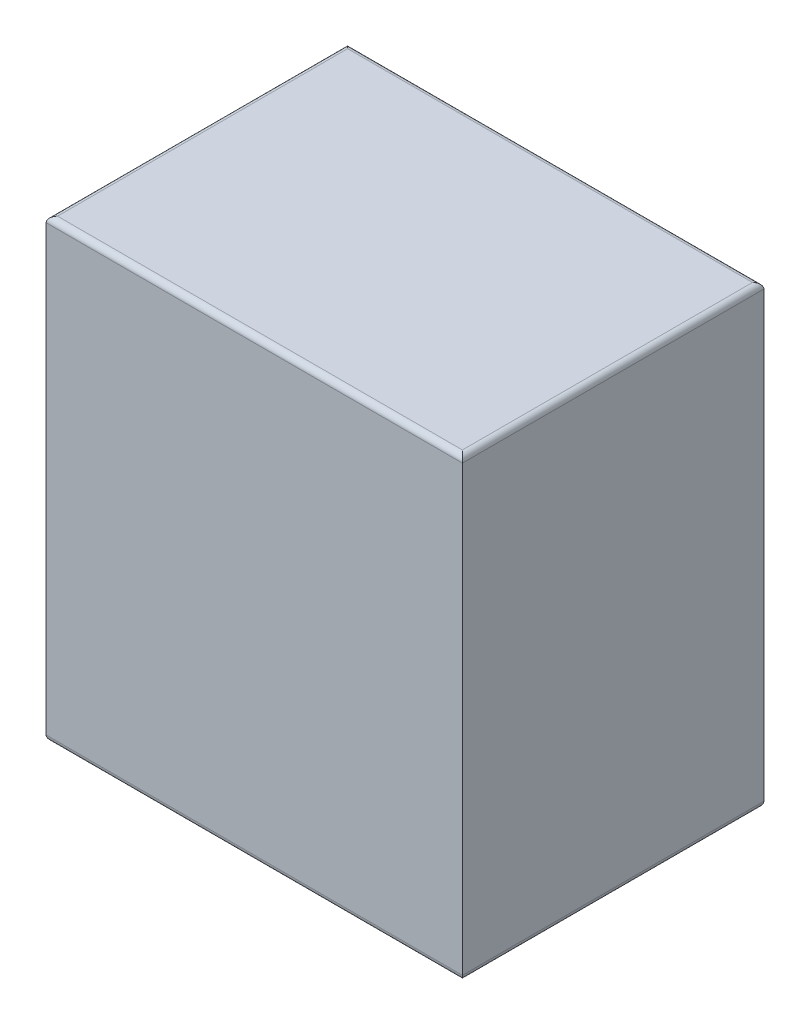
ISO-10303-21;
HEADER;
FILE_DESCRIPTION(('STEP AP214'),'2;1');
FILE_NAME('part.step','',(''),(''),'','','');
FILE_SCHEMA(('AUTOMOTIVE_DESIGN { 1 0 10303 214 1 1 1 1 }'));
ENDSEC;
DATA;
#1=APPLICATION_CONTEXT('core data for automotive mechanical design processes');
#2=APPLICATION_PROTOCOL_DEFINITION('international standard','automotive_design',2000,#1);
#3=PRODUCT_CONTEXT('',#1,'mechanical');
#4=PRODUCT('Part','Part','',(#3));
#5=PRODUCT_RELATED_PRODUCT_CATEGORY('part','',(#4));
#6=PRODUCT_DEFINITION_FORMATION('','',#4);
#7=PRODUCT_DEFINITION_CONTEXT('part definition',#1,'design');
#8=PRODUCT_DEFINITION('design','',#6,#7);
#9=PRODUCT_DEFINITION_SHAPE('','',#8);
#10=(LENGTH_UNIT() NAMED_UNIT(*) SI_UNIT(.MILLI.,.METRE.));
#11=(NAMED_UNIT(*) PLANE_ANGLE_UNIT() SI_UNIT($,.RADIAN.));
#12=(NAMED_UNIT(*) SI_UNIT($,.STERADIAN.) SOLID_ANGLE_UNIT());
#13=UNCERTAINTY_MEASURE_WITH_UNIT(LENGTH_MEASURE(1.E-05),#10,'distance_accuracy_value','');
#14=(GEOMETRIC_REPRESENTATION_CONTEXT(3) GLOBAL_UNCERTAINTY_ASSIGNED_CONTEXT((#13)) GLOBAL_UNIT_ASSIGNED_CONTEXT((#10,
#11,#12)) REPRESENTATION_CONTEXT('',''));
#15=CARTESIAN_POINT('',(0.,0.,0.));
#16=DIRECTION('',(0.,0.,1.));
#17=DIRECTION('',(1.,0.,0.));
#18=AXIS2_PLACEMENT_3D('',#15,#16,#17);
#19=CARTESIAN_POINT('',(37.0000003802642,40.,-0.430000271371788));
#20=DIRECTION('',(0.,0.,-1.));
#21=DIRECTION('',(-1.,0.,0.));
#22=AXIS2_PLACEMENT_3D('',#19,#20,#21);
#23=PLANE('',#22);
#24=DIRECTION('',(0.,-1.,0.));
#25=VECTOR('',#24,1.);
#26=CARTESIAN_POINT('',(0.400000380264234,40.,-0.430000271371784));
#27=LINE('',#26,#25);
#28=CARTESIAN_POINT('',(0.400000380264234,39.5,-0.430000271371784));
#29=VERTEX_POINT('',#28);
#30=CARTESIAN_POINT('',(0.400000380264234,0.5,-0.430000271371784));
#31=VERTEX_POINT('',#30);
#32=EDGE_CURVE('E163',#29,#31,#27,.T.);
#33=ORIENTED_EDGE('',*,*,#32,.T.);
#34=DIRECTION('',(1.,0.,0.));
#35=VECTOR('',#34,1.);
#36=CARTESIAN_POINT('',(37.0000003802642,0.5,-0.430000271371788));
#37=LINE('',#36,#35);
#38=CARTESIAN_POINT('',(37.0000003802642,0.5,-0.430000271371788));
#39=VERTEX_POINT('',#38);
#40=EDGE_CURVE('E130',#31,#39,#37,.T.);
#41=ORIENTED_EDGE('',*,*,#40,.T.);
#42=DIRECTION('',(0.,-1.,0.));
#43=VECTOR('',#42,1.);
#44=CARTESIAN_POINT('',(37.0000003802642,40.,-0.430000271371788));
#45=LINE('',#44,#43);
#46=CARTESIAN_POINT('',(37.0000003802642,39.5,-0.430000271371788));
#47=VERTEX_POINT('',#46);
#48=EDGE_CURVE('E114',#47,#39,#45,.T.);
#49=ORIENTED_EDGE('',*,*,#48,.F.);
#50=DIRECTION('',(1.,0.,0.));
#51=VECTOR('',#50,1.);
#52=CARTESIAN_POINT('',(37.0000003802642,39.5,-0.430000271371788));
#53=LINE('',#52,#51);
#54=EDGE_CURVE('E127',#47,#29,#53,.F.);
#55=ORIENTED_EDGE('',*,*,#54,.T.);
#56=EDGE_LOOP('',(#33,#41,#49,#55));
#57=FACE_BOUND('',#56,.T.);
#58=ADVANCED_FACE('F43',(#57),#23,.F.);
#59=CARTESIAN_POINT('',(37.0000003802642,40.,-26.9300002713718));
#60=DIRECTION('',(-1.,0.,0.));
#61=DIRECTION('',(0.,0.,1.));
#62=AXIS2_PLACEMENT_3D('',#59,#60,#61);
#63=PLANE('',#62);
#64=ORIENTED_EDGE('',*,*,#48,.T.);
#65=DIRECTION('',(0.,0.,-1.));
#66=VECTOR('',#65,1.);
#67=CARTESIAN_POINT('',(37.0000003802642,0.5,-26.9300002713718));
#68=LINE('',#67,#66);
#69=CARTESIAN_POINT('',(37.0000003802642,0.5,-26.9300002713718));
#70=VERTEX_POINT('',#69);
#71=EDGE_CURVE('E120',#39,#70,#68,.T.);
#72=ORIENTED_EDGE('',*,*,#71,.T.);
#73=DIRECTION('',(0.,-1.,0.));
#74=VECTOR('',#73,1.);
#75=CARTESIAN_POINT('',(37.0000003802642,40.,-26.9300002713718));
#76=LINE('',#75,#74);
#77=CARTESIAN_POINT('',(37.0000003802642,39.5,-26.9300002713718));
#78=VERTEX_POINT('',#77);
#79=EDGE_CURVE('E116',#78,#70,#76,.T.);
#80=ORIENTED_EDGE('',*,*,#79,.F.);
#81=DIRECTION('',(0.,0.,-1.));
#82=VECTOR('',#81,1.);
#83=CARTESIAN_POINT('',(37.0000003802642,39.5,-26.9300002713718));
#84=LINE('',#83,#82);
#85=EDGE_CURVE('E111',#78,#47,#84,.F.);
#86=ORIENTED_EDGE('',*,*,#85,.T.);
#87=EDGE_LOOP('',(#64,#72,#80,#86));
#88=FACE_BOUND('',#87,.T.);
#89=ADVANCED_FACE('F113',(#88),#63,.F.);
#90=CARTESIAN_POINT('',(0.400000380264241,40.,-26.9300002713718));
#91=DIRECTION('',(0.,0.,1.));
#92=DIRECTION('',(1.,0.,0.));
#93=AXIS2_PLACEMENT_3D('',#90,#91,#92);
#94=PLANE('',#93);
#95=ORIENTED_EDGE('',*,*,#79,.T.);
#96=DIRECTION('',(-1.,0.,0.));
#97=VECTOR('',#96,1.);
#98=CARTESIAN_POINT('',(0.400000380264241,0.5,-26.9300002713718));
#99=LINE('',#98,#97);
#100=CARTESIAN_POINT('',(0.400000380264241,0.5,-26.9300002713718));
#101=VERTEX_POINT('',#100);
#102=EDGE_CURVE('E187',#70,#101,#99,.T.);
#103=ORIENTED_EDGE('',*,*,#102,.T.);
#104=DIRECTION('',(0.,-1.,0.));
#105=VECTOR('',#104,1.);
#106=CARTESIAN_POINT('',(0.400000380264241,40.,-26.9300002713718));
#107=LINE('',#106,#105);
#108=CARTESIAN_POINT('',(0.400000380264241,39.5,-26.9300002713718));
#109=VERTEX_POINT('',#108);
#110=EDGE_CURVE('E168',#109,#101,#107,.T.);
#111=ORIENTED_EDGE('',*,*,#110,.F.);
#112=DIRECTION('',(-1.,0.,0.));
#113=VECTOR('',#112,1.);
#114=CARTESIAN_POINT('',(0.400000380264241,39.5,-26.9300002713718));
#115=LINE('',#114,#113);
#116=EDGE_CURVE('E185',#109,#78,#115,.F.);
#117=ORIENTED_EDGE('',*,*,#116,.T.);
#118=EDGE_LOOP('',(#95,#103,#111,#117));
#119=FACE_BOUND('',#118,.T.);
#120=ADVANCED_FACE('F204',(#119),#94,.F.);
#121=CARTESIAN_POINT('',(0.400000380264234,40.,-0.430000271371784));
#122=DIRECTION('',(1.,0.,0.));
#123=DIRECTION('',(0.,0.,-1.));
#124=AXIS2_PLACEMENT_3D('',#121,#122,#123);
#125=PLANE('',#124);
#126=ORIENTED_EDGE('',*,*,#110,.T.);
#127=DIRECTION('',(0.,0.,1.));
#128=VECTOR('',#127,1.);
#129=CARTESIAN_POINT('',(0.400000380264234,0.5,-0.430000271371784));
#130=LINE('',#129,#128);
#131=EDGE_CURVE('E191',#101,#31,#130,.T.);
#132=ORIENTED_EDGE('',*,*,#131,.T.);
#133=ORIENTED_EDGE('',*,*,#32,.F.);
#134=DIRECTION('',(0.,0.,1.));
#135=VECTOR('',#134,1.);
#136=CARTESIAN_POINT('',(0.400000380264234,39.5,-0.430000271371784));
#137=LINE('',#136,#135);
#138=EDGE_CURVE('E189',#29,#109,#137,.F.);
#139=ORIENTED_EDGE('',*,*,#138,.T.);
#140=EDGE_LOOP('',(#126,#132,#133,#139));
#141=FACE_BOUND('',#140,.T.);
#142=ADVANCED_FACE('F202',(#141),#125,.F.);
#143=CARTESIAN_POINT('',(0.,40.,0.));
#144=DIRECTION('',(0.,-1.,0.));
#145=DIRECTION('',(0.,0.,-1.));
#146=AXIS2_PLACEMENT_3D('',#143,#144,#145);
#147=PLANE('',#146);
#148=DIRECTION('',(0.,0.,1.));
#149=VECTOR('',#148,1.);
#150=CARTESIAN_POINT('',(0.900000380264234,40.,0.));
#151=LINE('',#150,#149);
#152=CARTESIAN_POINT('',(0.900000380264241,40.,-26.4300002713718));
#153=VERTEX_POINT('',#152);
#154=CARTESIAN_POINT('',(0.900000380264234,40.,-0.930000271371784));
#155=VERTEX_POINT('',#154);
#156=EDGE_CURVE('E193',#153,#155,#151,.T.);
#157=ORIENTED_EDGE('',*,*,#156,.T.);
#158=DIRECTION('',(1.,0.,0.));
#159=VECTOR('',#158,1.);
#160=CARTESIAN_POINT('',(0.,40.,-0.930000271371784));
#161=LINE('',#160,#159);
#162=CARTESIAN_POINT('',(36.5000003802642,40.,-0.930000271371788));
#163=VERTEX_POINT('',#162);
#164=EDGE_CURVE('E11',#155,#163,#161,.T.);
#165=ORIENTED_EDGE('',*,*,#164,.T.);
#166=DIRECTION('',(0.,0.,-1.));
#167=VECTOR('',#166,1.);
#168=CARTESIAN_POINT('',(36.5000003802642,40.,0.));
#169=LINE('',#168,#167);
#170=CARTESIAN_POINT('',(36.5000003802642,40.,-26.4300002713718));
#171=VERTEX_POINT('',#170);
#172=EDGE_CURVE('E52',#163,#171,#169,.T.);
#173=ORIENTED_EDGE('',*,*,#172,.T.);
#174=DIRECTION('',(-1.,0.,0.));
#175=VECTOR('',#174,1.);
#176=CARTESIAN_POINT('',(0.,40.,-26.4300002713718));
#177=LINE('',#176,#175);
#178=EDGE_CURVE('E195',#171,#153,#177,.T.);
#179=ORIENTED_EDGE('',*,*,#178,.T.);
#180=EDGE_LOOP('',(#157,#165,#173,#179));
#181=FACE_BOUND('',#180,.T.);
#182=ADVANCED_FACE('F196',(#181),#147,.F.);
#183=CARTESIAN_POINT('',(0.,0.,0.));
#184=DIRECTION('',(0.,-1.,0.));
#185=DIRECTION('',(0.,0.,-1.));
#186=AXIS2_PLACEMENT_3D('',#183,#184,#185);
#187=PLANE('',#186);
#188=DIRECTION('',(0.,0.,-1.));
#189=VECTOR('',#188,1.);
#190=CARTESIAN_POINT('',(36.5000003802642,0.,-0.430000271371786));
#191=LINE('',#190,#189);
#192=CARTESIAN_POINT('',(36.5000003802642,0.,-26.4300002713718));
#193=VERTEX_POINT('',#192);
#194=CARTESIAN_POINT('',(36.5000003802642,0.,-0.930000271371787));
#195=VERTEX_POINT('',#194);
#196=EDGE_CURVE('E180',#193,#195,#191,.F.);
#197=ORIENTED_EDGE('',*,*,#196,.T.);
#198=DIRECTION('',(1.,0.,0.));
#199=VECTOR('',#198,1.);
#200=CARTESIAN_POINT('',(0.400000380264234,0.,-0.930000271371784));
#201=LINE('',#200,#199);
#202=CARTESIAN_POINT('',(0.900000380264234,0.,-0.930000271371784));
#203=VERTEX_POINT('',#202);
#204=EDGE_CURVE('E121',#195,#203,#201,.F.);
#205=ORIENTED_EDGE('',*,*,#204,.T.);
#206=DIRECTION('',(0.,0.,1.));
#207=VECTOR('',#206,1.);
#208=CARTESIAN_POINT('',(0.900000380264241,0.,-26.9300002713718));
#209=LINE('',#208,#207);
#210=CARTESIAN_POINT('',(0.900000380264241,0.,-26.4300002713718));
#211=VERTEX_POINT('',#210);
#212=EDGE_CURVE('E176',#203,#211,#209,.F.);
#213=ORIENTED_EDGE('',*,*,#212,.T.);
#214=DIRECTION('',(-1.,0.,0.));
#215=VECTOR('',#214,1.);
#216=CARTESIAN_POINT('',(37.0000003802642,0.,-26.4300002713718));
#217=LINE('',#216,#215);
#218=EDGE_CURVE('E178',#211,#193,#217,.F.);
#219=ORIENTED_EDGE('',*,*,#218,.T.);
#220=EDGE_LOOP('',(#197,#205,#213,#219));
#221=FACE_BOUND('',#220,.T.);
#222=ADVANCED_FACE('F230',(#221),#187,.T.);
#223=CARTESIAN_POINT('',(0.400000380264241,0.5,-26.4300002713718));
#224=DIRECTION('',(1.,0.,0.));
#225=DIRECTION('',(0.,0.,-1.));
#226=AXIS2_PLACEMENT_3D('',#223,#224,#225);
#227=CYLINDRICAL_SURFACE('',#226,0.5);
#228=CARTESIAN_POINT('',(36.5000003802642,0.5,-26.4300002713718));
#229=DIRECTION('',(0.707106781186547,0.,0.707106781186548));
#230=DIRECTION('',(0.707106781186548,0.,-0.707106781186547));
#231=AXIS2_PLACEMENT_3D('',#228,#229,#230);
#232=ELLIPSE('',#231,0.707106781186548,0.5);
#233=EDGE_CURVE('E155',#193,#70,#232,.T.);
#234=ORIENTED_EDGE('',*,*,#233,.F.);
#235=ORIENTED_EDGE('',*,*,#218,.F.);
#236=CARTESIAN_POINT('',(0.900000380264241,0.5,-26.4300002713718));
#237=DIRECTION('',(0.707106781186548,0.,-0.707106781186547));
#238=DIRECTION('',(-0.707106781186547,0.,-0.707106781186548));
#239=AXIS2_PLACEMENT_3D('',#236,#237,#238);
#240=ELLIPSE('',#239,0.707106781186547,0.5);
#241=EDGE_CURVE('E142',#101,#211,#240,.F.);
#242=ORIENTED_EDGE('',*,*,#241,.F.);
#243=ORIENTED_EDGE('',*,*,#102,.F.);
#244=EDGE_LOOP('',(#234,#235,#242,#243));
#245=FACE_BOUND('',#244,.T.);
#246=ADVANCED_FACE('F207',(#245),#227,.T.);
#247=CARTESIAN_POINT('',(0.900000380264234,0.5,-0.430000271371784));
#248=DIRECTION('',(0.,0.,-1.));
#249=DIRECTION('',(-1.,0.,0.));
#250=AXIS2_PLACEMENT_3D('',#247,#248,#249);
#251=CYLINDRICAL_SURFACE('',#250,0.5);
#252=ORIENTED_EDGE('',*,*,#241,.T.);
#253=ORIENTED_EDGE('',*,*,#212,.F.);
#254=CARTESIAN_POINT('',(0.900000380264234,0.5,-0.930000271371784));
#255=DIRECTION('',(-0.707106781186547,0.,-0.707106781186547));
#256=DIRECTION('',(0.707106781186548,0.,-0.707106781186547));
#257=AXIS2_PLACEMENT_3D('',#254,#255,#256);
#258=ELLIPSE('',#257,0.707106781186548,0.5);
#259=EDGE_CURVE('E149',#31,#203,#258,.F.);
#260=ORIENTED_EDGE('',*,*,#259,.F.);
#261=ORIENTED_EDGE('',*,*,#131,.F.);
#262=EDGE_LOOP('',(#252,#253,#260,#261));
#263=FACE_BOUND('',#262,.T.);
#264=ADVANCED_FACE('F209',(#263),#251,.T.);
#265=CARTESIAN_POINT('',(36.5000003802642,0.5,-26.9300002713718));
#266=DIRECTION('',(0.,0.,1.));
#267=DIRECTION('',(1.,0.,0.));
#268=AXIS2_PLACEMENT_3D('',#265,#266,#267);
#269=CYLINDRICAL_SURFACE('',#268,0.5);
#270=ORIENTED_EDGE('',*,*,#233,.T.);
#271=ORIENTED_EDGE('',*,*,#71,.F.);
#272=CARTESIAN_POINT('',(36.5000003802642,0.5,-0.930000271371787));
#273=DIRECTION('',(-0.707106781186548,0.,0.707106781186547));
#274=DIRECTION('',(0.707106781186547,0.,0.707106781186547));
#275=AXIS2_PLACEMENT_3D('',#272,#273,#274);
#276=ELLIPSE('',#275,0.707106781186547,0.5);
#277=EDGE_CURVE('E145',#195,#39,#276,.T.);
#278=ORIENTED_EDGE('',*,*,#277,.F.);
#279=ORIENTED_EDGE('',*,*,#196,.F.);
#280=EDGE_LOOP('',(#270,#271,#278,#279));
#281=FACE_BOUND('',#280,.T.);
#282=ADVANCED_FACE('F212',(#281),#269,.T.);
#283=CARTESIAN_POINT('',(37.0000003802642,0.5,-0.930000271371788));
#284=DIRECTION('',(-1.,0.,0.));
#285=DIRECTION('',(0.,0.,1.));
#286=AXIS2_PLACEMENT_3D('',#283,#284,#285);
#287=CYLINDRICAL_SURFACE('',#286,0.5);
#288=ORIENTED_EDGE('',*,*,#259,.T.);
#289=ORIENTED_EDGE('',*,*,#204,.F.);
#290=ORIENTED_EDGE('',*,*,#277,.T.);
#291=ORIENTED_EDGE('',*,*,#40,.F.);
#292=EDGE_LOOP('',(#288,#289,#290,#291));
#293=FACE_BOUND('',#292,.T.);
#294=ADVANCED_FACE('F210',(#293),#287,.T.);
#295=CARTESIAN_POINT('',(0.,39.5,-26.4300002713718));
#296=DIRECTION('',(-1.,0.,0.));
#297=DIRECTION('',(0.,0.,1.));
#298=AXIS2_PLACEMENT_3D('',#295,#296,#297);
#299=CYLINDRICAL_SURFACE('',#298,0.5);
#300=CARTESIAN_POINT('',(36.5000003802642,39.5,-26.4300002713718));
#301=DIRECTION('',(-0.707106781186547,0.,-0.707106781186548));
#302=DIRECTION('',(-0.707106781186548,0.,0.707106781186547));
#303=AXIS2_PLACEMENT_3D('',#300,#301,#302);
#304=ELLIPSE('',#303,0.707106781186548,0.5);
#305=EDGE_CURVE('E139',#78,#171,#304,.F.);
#306=ORIENTED_EDGE('',*,*,#305,.F.);
#307=ORIENTED_EDGE('',*,*,#116,.F.);
#308=CARTESIAN_POINT('',(0.900000380264241,39.5,-26.4300002713718));
#309=DIRECTION('',(-0.707106781186548,0.,0.707106781186547));
#310=DIRECTION('',(0.707106781186547,0.,0.707106781186548));
#311=AXIS2_PLACEMENT_3D('',#308,#309,#310);
#312=ELLIPSE('',#311,0.707106781186547,0.5);
#313=EDGE_CURVE('E47',#153,#109,#312,.T.);
#314=ORIENTED_EDGE('',*,*,#313,.F.);
#315=ORIENTED_EDGE('',*,*,#178,.F.);
#316=EDGE_LOOP('',(#306,#307,#314,#315));
#317=FACE_BOUND('',#316,.T.);
#318=ADVANCED_FACE('F45',(#317),#299,.T.);
#319=CARTESIAN_POINT('',(0.900000380264234,39.5,0.));
#320=DIRECTION('',(0.,0.,1.));
#321=DIRECTION('',(1.,0.,0.));
#322=AXIS2_PLACEMENT_3D('',#319,#320,#321);
#323=CYLINDRICAL_SURFACE('',#322,0.5);
#324=ORIENTED_EDGE('',*,*,#313,.T.);
#325=ORIENTED_EDGE('',*,*,#138,.F.);
#326=CARTESIAN_POINT('',(0.900000380264234,39.5,-0.930000271371784));
#327=DIRECTION('',(0.707106781186547,0.,0.707106781186547));
#328=DIRECTION('',(-0.707106781186548,0.,0.707106781186547));
#329=AXIS2_PLACEMENT_3D('',#326,#327,#328);
#330=ELLIPSE('',#329,0.707106781186548,0.5);
#331=EDGE_CURVE('E134',#155,#29,#330,.T.);
#332=ORIENTED_EDGE('',*,*,#331,.F.);
#333=ORIENTED_EDGE('',*,*,#156,.F.);
#334=EDGE_LOOP('',(#324,#325,#332,#333));
#335=FACE_BOUND('',#334,.T.);
#336=ADVANCED_FACE('F199',(#335),#323,.T.);
#337=CARTESIAN_POINT('',(36.5000003802642,39.5,0.));
#338=DIRECTION('',(0.,0.,-1.));
#339=DIRECTION('',(-1.,0.,0.));
#340=AXIS2_PLACEMENT_3D('',#337,#338,#339);
#341=CYLINDRICAL_SURFACE('',#340,0.5);
#342=ORIENTED_EDGE('',*,*,#305,.T.);
#343=ORIENTED_EDGE('',*,*,#172,.F.);
#344=CARTESIAN_POINT('',(36.5000003802642,39.5,-0.930000271371788));
#345=DIRECTION('',(0.707106781186548,0.,-0.707106781186547));
#346=DIRECTION('',(-0.707106781186547,0.,-0.707106781186547));
#347=AXIS2_PLACEMENT_3D('',#344,#345,#346);
#348=ELLIPSE('',#347,0.707106781186547,0.5);
#349=EDGE_CURVE('E60',#47,#163,#348,.F.);
#350=ORIENTED_EDGE('',*,*,#349,.F.);
#351=ORIENTED_EDGE('',*,*,#85,.F.);
#352=EDGE_LOOP('',(#342,#343,#350,#351));
#353=FACE_BOUND('',#352,.T.);
#354=ADVANCED_FACE('F137',(#353),#341,.T.);
#355=CARTESIAN_POINT('',(0.,39.5,-0.930000271371784));
#356=DIRECTION('',(1.,0.,0.));
#357=DIRECTION('',(0.,0.,-1.));
#358=AXIS2_PLACEMENT_3D('',#355,#356,#357);
#359=CYLINDRICAL_SURFACE('',#358,0.5);
#360=ORIENTED_EDGE('',*,*,#331,.T.);
#361=ORIENTED_EDGE('',*,*,#54,.F.);
#362=ORIENTED_EDGE('',*,*,#349,.T.);
#363=ORIENTED_EDGE('',*,*,#164,.F.);
#364=EDGE_LOOP('',(#360,#361,#362,#363));
#365=FACE_BOUND('',#364,.T.);
#366=ADVANCED_FACE('F132',(#365),#359,.T.);
#367=CLOSED_SHELL('',(#58,#89,#120,#142,#182,#222,#246,#264,#282,#294,#318,#336,#354,#366));
#368=MANIFOLD_SOLID_BREP('B2',#367);
#369=ADVANCED_BREP_SHAPE_REPRESENTATION('',(#18,#368),#14);
#370=SHAPE_DEFINITION_REPRESENTATION(#9,#369);
ENDSEC;
END-ISO-10303-21;
